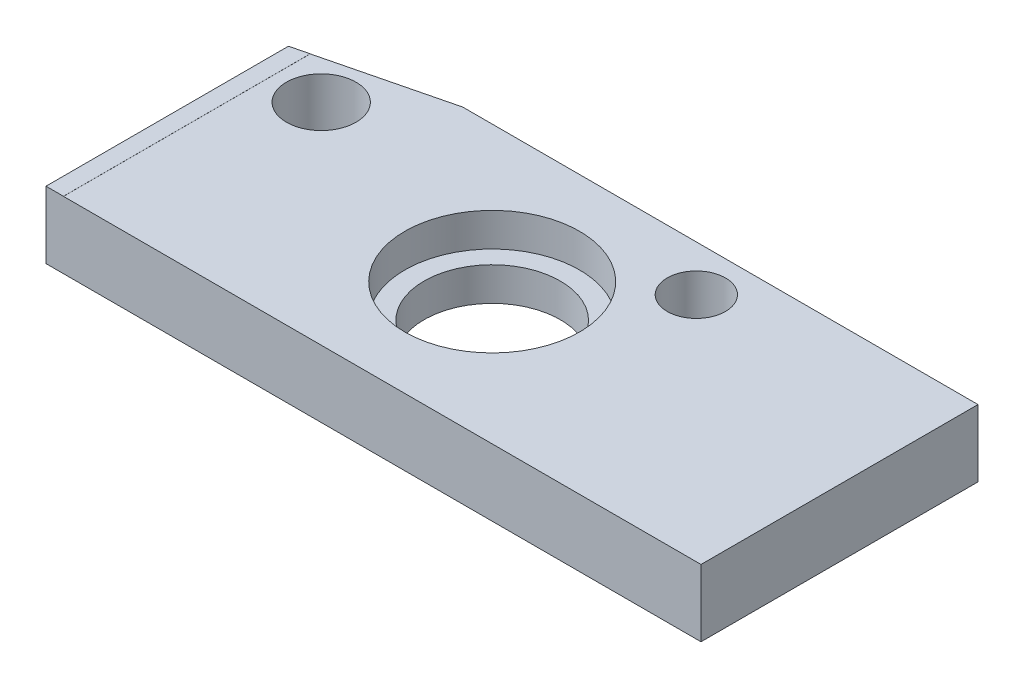
ISO-10303-21;
HEADER;
FILE_DESCRIPTION(('STEP AP214'),'2;1');
FILE_NAME('part.step','',(''),(''),'','','');
FILE_SCHEMA(('AUTOMOTIVE_DESIGN { 1 0 10303 214 1 1 1 1 }'));
ENDSEC;
DATA;
#1=APPLICATION_CONTEXT('core data for automotive mechanical design processes');
#2=APPLICATION_PROTOCOL_DEFINITION('international standard','automotive_design',2000,#1);
#3=PRODUCT_CONTEXT('',#1,'mechanical');
#4=PRODUCT('Part','Part','',(#3));
#5=PRODUCT_RELATED_PRODUCT_CATEGORY('part','',(#4));
#6=PRODUCT_DEFINITION_FORMATION('','',#4);
#7=PRODUCT_DEFINITION_CONTEXT('part definition',#1,'design');
#8=PRODUCT_DEFINITION('design','',#6,#7);
#9=PRODUCT_DEFINITION_SHAPE('','',#8);
#10=(LENGTH_UNIT() NAMED_UNIT(*) SI_UNIT(.MILLI.,.METRE.));
#11=(NAMED_UNIT(*) PLANE_ANGLE_UNIT() SI_UNIT($,.RADIAN.));
#12=(NAMED_UNIT(*) SI_UNIT($,.STERADIAN.) SOLID_ANGLE_UNIT());
#13=UNCERTAINTY_MEASURE_WITH_UNIT(LENGTH_MEASURE(1.E-05),#10,'distance_accuracy_value','');
#14=(GEOMETRIC_REPRESENTATION_CONTEXT(3) GLOBAL_UNCERTAINTY_ASSIGNED_CONTEXT((#13)) GLOBAL_UNIT_ASSIGNED_CONTEXT((#10,
#11,#12)) REPRESENTATION_CONTEXT('',''));
#15=CARTESIAN_POINT('',(0.,0.,0.));
#16=DIRECTION('',(0.,0.,1.));
#17=DIRECTION('',(1.,0.,0.));
#18=AXIS2_PLACEMENT_3D('',#15,#16,#17);
#19=CARTESIAN_POINT('',(0.,24.35352,0.));
#20=DIRECTION('',(0.,1.,0.));
#21=DIRECTION('',(0.,0.,1.));
#22=AXIS2_PLACEMENT_3D('',#19,#20,#21);
#23=PLANE('',#22);
#24=CARTESIAN_POINT('',(104.78262,24.35352,-51.0794));
#25=DIRECTION('',(0.,1.,0.));
#26=DIRECTION('',(0.,0.,1.));
#27=AXIS2_PLACEMENT_3D('',#24,#25,#26);
#28=CIRCLE('',#27,31.75);
#29=CARTESIAN_POINT('',(104.78262,24.35352,-19.3294));
#30=VERTEX_POINT('',#29);
#31=EDGE_CURVE('E132',#30,#30,#28,.T.);
#32=ORIENTED_EDGE('',*,*,#31,.F.);
#33=EDGE_LOOP('',(#32));
#34=FACE_BOUND('',#33,.T.);
#35=CARTESIAN_POINT('',(17.2084999999999,24.35352,-76.49718));
#36=DIRECTION('',(0.,1.,0.));
#37=DIRECTION('',(0.,0.,1.));
#38=AXIS2_PLACEMENT_3D('',#35,#36,#37);
#39=CIRCLE('',#38,12.64539);
#40=CARTESIAN_POINT('',(17.2084999999999,24.35352,-63.85179));
#41=VERTEX_POINT('',#40);
#42=EDGE_CURVE('E143',#41,#41,#39,.T.);
#43=ORIENTED_EDGE('',*,*,#42,.F.);
#44=EDGE_LOOP('',(#43));
#45=FACE_BOUND('',#44,.T.);
#46=CARTESIAN_POINT('',(145.99666,24.35352,-84.074));
#47=DIRECTION('',(0.,1.,0.));
#48=DIRECTION('',(0.,0.,1.));
#49=AXIS2_PLACEMENT_3D('',#46,#47,#48);
#50=CIRCLE('',#49,10.58672);
#51=CARTESIAN_POINT('',(145.99666,24.35352,-73.48728));
#52=VERTEX_POINT('',#51);
#53=EDGE_CURVE('E146',#52,#52,#50,.T.);
#54=ORIENTED_EDGE('',*,*,#53,.F.);
#55=EDGE_LOOP('',(#54));
#56=FACE_BOUND('',#55,.T.);
#57=DIRECTION('',(1.,0.,0.));
#58=VECTOR('',#57,1.);
#59=CARTESIAN_POINT('',(0.,24.35352,-100.69322));
#60=LINE('',#59,#58);
#61=CARTESIAN_POINT('',(44.45,24.35352,-100.69322));
#62=VERTEX_POINT('',#61);
#63=CARTESIAN_POINT('',(231.775,24.35352,-100.69322));
#64=VERTEX_POINT('',#63);
#65=EDGE_CURVE('E51',#62,#64,#60,.T.);
#66=ORIENTED_EDGE('',*,*,#65,.F.);
#67=DIRECTION('',(-0.970797765676104,0.,0.239899350058071));
#68=VECTOR('',#67,1.);
#69=CARTESIAN_POINT('',(-20.8926489266877,24.35352,-84.5460268740785));
#70=LINE('',#69,#68);
#71=CARTESIAN_POINT('',(0.,24.35352,-89.7089280216859));
#72=VERTEX_POINT('',#71);
#73=EDGE_CURVE('E121',#62,#72,#70,.T.);
#74=ORIENTED_EDGE('',*,*,#73,.T.);
#75=DIRECTION('',(0.,0.,1.));
#76=VECTOR('',#75,1.);
#77=CARTESIAN_POINT('',(0.,24.35352,-100.69322));
#78=LINE('',#77,#76);
#79=CARTESIAN_POINT('',(0.,24.35352,0.));
#80=VERTEX_POINT('',#79);
#81=EDGE_CURVE('E118',#72,#80,#78,.T.);
#82=ORIENTED_EDGE('',*,*,#81,.T.);
#83=DIRECTION('',(1.,0.,0.));
#84=VECTOR('',#83,1.);
#85=CARTESIAN_POINT('',(0.,24.35352,0.));
#86=LINE('',#85,#84);
#87=CARTESIAN_POINT('',(231.775,24.35352,0.));
#88=VERTEX_POINT('',#87);
#89=EDGE_CURVE('E172',#80,#88,#86,.T.);
#90=ORIENTED_EDGE('',*,*,#89,.T.);
#91=DIRECTION('',(0.,0.,-1.));
#92=VECTOR('',#91,1.);
#93=CARTESIAN_POINT('',(231.775,24.35352,0.));
#94=LINE('',#93,#92);
#95=EDGE_CURVE('E154',#88,#64,#94,.T.);
#96=ORIENTED_EDGE('',*,*,#95,.T.);
#97=EDGE_LOOP('',(#66,#74,#82,#90,#96));
#98=FACE_BOUND('',#97,.T.);
#99=ADVANCED_FACE('F43',(#34,#45,#56,#98),#23,.T.);
#100=CARTESIAN_POINT('',(0.,0.,0.));
#101=DIRECTION('',(0.,1.,0.));
#102=DIRECTION('',(0.,0.,1.));
#103=AXIS2_PLACEMENT_3D('',#100,#101,#102);
#104=PLANE('',#103);
#105=CARTESIAN_POINT('',(104.78262,0.,-51.0794));
#106=DIRECTION('',(0.,1.,0.));
#107=DIRECTION('',(0.,0.,1.));
#108=AXIS2_PLACEMENT_3D('',#105,#106,#107);
#109=CIRCLE('',#108,24.765);
#110=CARTESIAN_POINT('',(104.78262,0.,-26.3144));
#111=VERTEX_POINT('',#110);
#112=EDGE_CURVE('E304',#111,#111,#109,.T.);
#113=ORIENTED_EDGE('',*,*,#112,.T.);
#114=EDGE_LOOP('',(#113));
#115=FACE_BOUND('',#114,.T.);
#116=CARTESIAN_POINT('',(145.99666,0.,-84.074));
#117=DIRECTION('',(0.,1.,0.));
#118=DIRECTION('',(0.,0.,1.));
#119=AXIS2_PLACEMENT_3D('',#116,#117,#118);
#120=CIRCLE('',#119,10.58672);
#121=CARTESIAN_POINT('',(145.99666,0.,-73.48728));
#122=VERTEX_POINT('',#121);
#123=EDGE_CURVE('E138',#122,#122,#120,.T.);
#124=ORIENTED_EDGE('',*,*,#123,.T.);
#125=EDGE_LOOP('',(#124));
#126=FACE_BOUND('',#125,.T.);
#127=CARTESIAN_POINT('',(17.2084999999999,0.,-76.49718));
#128=DIRECTION('',(0.,1.,0.));
#129=DIRECTION('',(0.,0.,1.));
#130=AXIS2_PLACEMENT_3D('',#127,#128,#129);
#131=CIRCLE('',#130,12.64539);
#132=CARTESIAN_POINT('',(17.2084999999999,0.,-63.85179));
#133=VERTEX_POINT('',#132);
#134=EDGE_CURVE('E139',#133,#133,#131,.T.);
#135=ORIENTED_EDGE('',*,*,#134,.T.);
#136=EDGE_LOOP('',(#135));
#137=FACE_BOUND('',#136,.T.);
#138=DIRECTION('',(-0.970797765676104,0.,0.239899350058071));
#139=VECTOR('',#138,1.);
#140=CARTESIAN_POINT('',(-20.8926489266877,0.,-84.5460268740785));
#141=LINE('',#140,#139);
#142=CARTESIAN_POINT('',(44.45,0.,-100.69322));
#143=VERTEX_POINT('',#142);
#144=CARTESIAN_POINT('',(-6.35000000000006,0.,-88.1397434533553));
#145=VERTEX_POINT('',#144);
#146=EDGE_CURVE('E66',#143,#145,#141,.T.);
#147=ORIENTED_EDGE('',*,*,#146,.F.);
#148=DIRECTION('',(1.,0.,0.));
#149=VECTOR('',#148,1.);
#150=CARTESIAN_POINT('',(0.,0.,-100.69322));
#151=LINE('',#150,#149);
#152=CARTESIAN_POINT('',(231.775,0.,-100.69322));
#153=VERTEX_POINT('',#152);
#154=EDGE_CURVE('E173',#143,#153,#151,.T.);
#155=ORIENTED_EDGE('',*,*,#154,.T.);
#156=DIRECTION('',(0.,0.,-1.));
#157=VECTOR('',#156,1.);
#158=CARTESIAN_POINT('',(231.775,0.,0.));
#159=LINE('',#158,#157);
#160=CARTESIAN_POINT('',(231.775,0.,0.));
#161=VERTEX_POINT('',#160);
#162=EDGE_CURVE('E157',#161,#153,#159,.T.);
#163=ORIENTED_EDGE('',*,*,#162,.F.);
#164=DIRECTION('',(1.,0.,0.));
#165=VECTOR('',#164,1.);
#166=CARTESIAN_POINT('',(0.,0.,0.));
#167=LINE('',#166,#165);
#168=CARTESIAN_POINT('',(-6.35000000000006,0.,0.));
#169=VERTEX_POINT('',#168);
#170=EDGE_CURVE('E111',#169,#161,#167,.T.);
#171=ORIENTED_EDGE('',*,*,#170,.F.);
#172=DIRECTION('',(0.,0.,-1.));
#173=VECTOR('',#172,1.);
#174=CARTESIAN_POINT('',(-6.35000000000006,0.,0.));
#175=LINE('',#174,#173);
#176=EDGE_CURVE('E168',#169,#145,#175,.T.);
#177=ORIENTED_EDGE('',*,*,#176,.T.);
#178=EDGE_LOOP('',(#147,#155,#163,#171,#177));
#179=FACE_BOUND('',#178,.T.);
#180=ADVANCED_FACE('F177',(#115,#126,#137,#179),#104,.F.);
#181=CARTESIAN_POINT('',(0.,0.,0.));
#182=DIRECTION('',(-1.,0.,0.));
#183=DIRECTION('',(0.,0.,1.));
#184=AXIS2_PLACEMENT_3D('',#181,#182,#183);
#185=PLANE('',#184);
#186=DIRECTION('',(0.,-1.,0.));
#187=VECTOR('',#186,1.);
#188=CARTESIAN_POINT('',(0.,0.,-89.7089280216859));
#189=LINE('',#188,#187);
#190=CARTESIAN_POINT('',(0.,24.3853764658297,-89.7089280216859));
#191=VERTEX_POINT('',#190);
#192=EDGE_CURVE('E116',#191,#72,#189,.T.);
#193=ORIENTED_EDGE('',*,*,#192,.F.);
#194=DIRECTION('',(0.,0.,-1.));
#195=VECTOR('',#194,1.);
#196=CARTESIAN_POINT('',(0.,24.3853764658297,0.));
#197=LINE('',#196,#195);
#198=CARTESIAN_POINT('',(0.,24.3853764658297,0.));
#199=VERTEX_POINT('',#198);
#200=EDGE_CURVE('E103',#199,#191,#197,.T.);
#201=ORIENTED_EDGE('',*,*,#200,.F.);
#202=DIRECTION('',(0.,1.,0.));
#203=VECTOR('',#202,1.);
#204=CARTESIAN_POINT('',(0.,0.,0.));
#205=LINE('',#204,#203);
#206=EDGE_CURVE('E160',#80,#199,#205,.T.);
#207=ORIENTED_EDGE('',*,*,#206,.F.);
#208=ORIENTED_EDGE('',*,*,#81,.F.);
#209=EDGE_LOOP('',(#193,#201,#207,#208));
#210=FACE_BOUND('',#209,.T.);
#211=ADVANCED_FACE('F117',(#210),#185,.F.);
#212=CARTESIAN_POINT('',(0.,24.3853764658297,0.));
#213=DIRECTION('',(0.,-1.,0.));
#214=DIRECTION('',(1.,0.,0.));
#215=AXIS2_PLACEMENT_3D('',#212,#213,#214);
#216=PLANE('',#215);
#217=DIRECTION('',(0.970797765676104,0.,-0.239899350058071));
#218=VECTOR('',#217,1.);
#219=CARTESIAN_POINT('',(-20.8926489266878,24.3853764658297,-84.5460268740785));
#220=LINE('',#219,#218);
#221=CARTESIAN_POINT('',(-6.35000000000006,24.3853764658297,-88.1397434533553));
#222=VERTEX_POINT('',#221);
#223=EDGE_CURVE('E11',#222,#191,#220,.T.);
#224=ORIENTED_EDGE('',*,*,#223,.F.);
#225=DIRECTION('',(0.,0.,-1.));
#226=VECTOR('',#225,1.);
#227=CARTESIAN_POINT('',(-6.35000000000006,24.3853764658297,0.));
#228=LINE('',#227,#226);
#229=CARTESIAN_POINT('',(-6.35000000000006,24.3853764658297,0.));
#230=VERTEX_POINT('',#229);
#231=EDGE_CURVE('E112',#230,#222,#228,.T.);
#232=ORIENTED_EDGE('',*,*,#231,.F.);
#233=DIRECTION('',(-1.,0.,0.));
#234=VECTOR('',#233,1.);
#235=CARTESIAN_POINT('',(0.,24.3853764658297,0.));
#236=LINE('',#235,#234);
#237=EDGE_CURVE('E108',#199,#230,#236,.T.);
#238=ORIENTED_EDGE('',*,*,#237,.F.);
#239=ORIENTED_EDGE('',*,*,#200,.T.);
#240=EDGE_LOOP('',(#224,#232,#238,#239));
#241=FACE_BOUND('',#240,.T.);
#242=ADVANCED_FACE('F105',(#241),#216,.F.);
#243=CARTESIAN_POINT('',(0.,24.35352,0.));
#244=DIRECTION('',(0.,0.,-1.));
#245=DIRECTION('',(-1.,0.,0.));
#246=AXIS2_PLACEMENT_3D('',#243,#244,#245);
#247=PLANE('',#246);
#248=ORIENTED_EDGE('',*,*,#170,.T.);
#249=DIRECTION('',(0.,-1.,0.));
#250=VECTOR('',#249,1.);
#251=CARTESIAN_POINT('',(231.775,0.,0.));
#252=LINE('',#251,#250);
#253=EDGE_CURVE('E151',#88,#161,#252,.T.);
#254=ORIENTED_EDGE('',*,*,#253,.F.);
#255=ORIENTED_EDGE('',*,*,#89,.F.);
#256=ORIENTED_EDGE('',*,*,#206,.T.);
#257=ORIENTED_EDGE('',*,*,#237,.T.);
#258=DIRECTION('',(0.,-1.,0.));
#259=VECTOR('',#258,1.);
#260=CARTESIAN_POINT('',(-6.35000000000006,0.,0.));
#261=LINE('',#260,#259);
#262=EDGE_CURVE('E165',#230,#169,#261,.T.);
#263=ORIENTED_EDGE('',*,*,#262,.T.);
#264=EDGE_LOOP('',(#248,#254,#255,#256,#257,#263));
#265=FACE_BOUND('',#264,.T.);
#266=ADVANCED_FACE('F45',(#265),#247,.F.);
#267=CARTESIAN_POINT('',(0.,24.35352,-100.69322));
#268=DIRECTION('',(0.,0.,-1.));
#269=DIRECTION('',(-1.,0.,0.));
#270=AXIS2_PLACEMENT_3D('',#267,#268,#269);
#271=PLANE('',#270);
#272=DIRECTION('',(0.,-1.,0.));
#273=VECTOR('',#272,1.);
#274=CARTESIAN_POINT('',(44.4499999999997,379.475723811632,-100.69322));
#275=LINE('',#274,#273);
#276=EDGE_CURVE('E58',#62,#143,#275,.T.);
#277=ORIENTED_EDGE('',*,*,#276,.F.);
#278=ORIENTED_EDGE('',*,*,#65,.T.);
#279=DIRECTION('',(0.,-1.,0.));
#280=VECTOR('',#279,1.);
#281=CARTESIAN_POINT('',(231.775,0.,-100.69322));
#282=LINE('',#281,#280);
#283=EDGE_CURVE('E142',#64,#153,#282,.T.);
#284=ORIENTED_EDGE('',*,*,#283,.T.);
#285=ORIENTED_EDGE('',*,*,#154,.F.);
#286=EDGE_LOOP('',(#277,#278,#284,#285));
#287=FACE_BOUND('',#286,.T.);
#288=ADVANCED_FACE('F183',(#287),#271,.T.);
#289=CARTESIAN_POINT('',(-6.35000000000006,0.,0.));
#290=DIRECTION('',(1.,0.,0.));
#291=DIRECTION('',(0.,0.,-1.));
#292=AXIS2_PLACEMENT_3D('',#289,#290,#291);
#293=PLANE('',#292);
#294=ORIENTED_EDGE('',*,*,#231,.T.);
#295=DIRECTION('',(0.,-1.,0.));
#296=VECTOR('',#295,1.);
#297=CARTESIAN_POINT('',(-6.35000000000025,379.475723811632,-88.1397434533553));
#298=LINE('',#297,#296);
#299=EDGE_CURVE('E125',#222,#145,#298,.T.);
#300=ORIENTED_EDGE('',*,*,#299,.T.);
#301=ORIENTED_EDGE('',*,*,#176,.F.);
#302=ORIENTED_EDGE('',*,*,#262,.F.);
#303=EDGE_LOOP('',(#294,#300,#301,#302));
#304=FACE_BOUND('',#303,.T.);
#305=ADVANCED_FACE('F188',(#304),#293,.F.);
#306=CARTESIAN_POINT('',(231.775,0.,0.));
#307=DIRECTION('',(1.,0.,0.));
#308=DIRECTION('',(0.,0.,-1.));
#309=AXIS2_PLACEMENT_3D('',#306,#307,#308);
#310=PLANE('',#309);
#311=ORIENTED_EDGE('',*,*,#283,.F.);
#312=ORIENTED_EDGE('',*,*,#95,.F.);
#313=ORIENTED_EDGE('',*,*,#253,.T.);
#314=ORIENTED_EDGE('',*,*,#162,.T.);
#315=EDGE_LOOP('',(#311,#312,#313,#314));
#316=FACE_BOUND('',#315,.T.);
#317=ADVANCED_FACE('F180',(#316),#310,.T.);
#318=CARTESIAN_POINT('',(145.99666,0.,-84.074));
#319=DIRECTION('',(0.,1.,0.));
#320=DIRECTION('',(0.,0.,1.));
#321=AXIS2_PLACEMENT_3D('',#318,#319,#320);
#322=CYLINDRICAL_SURFACE('',#321,10.58672);
#323=ORIENTED_EDGE('',*,*,#123,.F.);
#324=EDGE_LOOP('',(#323));
#325=FACE_BOUND('',#324,.T.);
#326=ORIENTED_EDGE('',*,*,#53,.T.);
#327=EDGE_LOOP('',(#326));
#328=FACE_BOUND('',#327,.T.);
#329=ADVANCED_FACE('F196',(#325,#328),#322,.F.);
#330=CARTESIAN_POINT('',(17.2084999999999,0.,-76.49718));
#331=DIRECTION('',(0.,1.,0.));
#332=DIRECTION('',(0.,0.,1.));
#333=AXIS2_PLACEMENT_3D('',#330,#331,#332);
#334=CYLINDRICAL_SURFACE('',#333,12.64539);
#335=ORIENTED_EDGE('',*,*,#134,.F.);
#336=EDGE_LOOP('',(#335));
#337=FACE_BOUND('',#336,.T.);
#338=ORIENTED_EDGE('',*,*,#42,.T.);
#339=EDGE_LOOP('',(#338));
#340=FACE_BOUND('',#339,.T.);
#341=ADVANCED_FACE('F231',(#337,#340),#334,.F.);
#342=CARTESIAN_POINT('',(-6.35000000000025,379.475723811632,-88.1397434533553));
#343=DIRECTION('',(-0.239899350058071,0.,-0.970797765676104));
#344=DIRECTION('',(-0.970797765676104,0.,0.239899350058071));
#345=AXIS2_PLACEMENT_3D('',#342,#343,#344);
#346=PLANE('',#345);
#347=ORIENTED_EDGE('',*,*,#276,.T.);
#348=ORIENTED_EDGE('',*,*,#146,.T.);
#349=ORIENTED_EDGE('',*,*,#299,.F.);
#350=ORIENTED_EDGE('',*,*,#223,.T.);
#351=ORIENTED_EDGE('',*,*,#192,.T.);
#352=ORIENTED_EDGE('',*,*,#73,.F.);
#353=EDGE_LOOP('',(#347,#348,#349,#350,#351,#352));
#354=FACE_BOUND('',#353,.T.);
#355=ADVANCED_FACE('F124',(#354),#346,.T.);
#356=CARTESIAN_POINT('',(104.78262,12.17676,-51.0794));
#357=DIRECTION('',(0.,1.,0.));
#358=DIRECTION('',(0.,0.,1.));
#359=AXIS2_PLACEMENT_3D('',#356,#357,#358);
#360=CYLINDRICAL_SURFACE('',#359,31.75);
#361=CARTESIAN_POINT('',(104.78262,12.17676,-51.0794));
#362=DIRECTION('',(0.,1.,0.));
#363=DIRECTION('',(0.,0.,1.));
#364=AXIS2_PLACEMENT_3D('',#361,#362,#363);
#365=CIRCLE('',#364,31.75);
#366=CARTESIAN_POINT('',(104.78262,12.17676,-19.3294));
#367=VERTEX_POINT('',#366);
#368=EDGE_CURVE('E128',#367,#367,#365,.T.);
#369=CARTESIAN_POINT('',(104.78262,12.17676,-19.3294));
#370=CARTESIAN_POINT('',(104.78262,12.30360125,-19.3294));
#371=CARTESIAN_POINT('',(104.78262,12.4304425,-19.3294));
#372=CARTESIAN_POINT('',(104.78262,12.684125,-19.3294));
#373=CARTESIAN_POINT('',(104.78262,12.81096625,-19.3294));
#374=CARTESIAN_POINT('',(104.78262,13.06464875,-19.3294));
#375=CARTESIAN_POINT('',(104.78262,13.19149,-19.3294));
#376=CARTESIAN_POINT('',(104.78262,13.4451725,-19.3294));
#377=CARTESIAN_POINT('',(104.78262,13.57201375,-19.3294));
#378=CARTESIAN_POINT('',(104.78262,13.82569625,-19.3294));
#379=CARTESIAN_POINT('',(104.78262,13.9525375,-19.3294));
#380=CARTESIAN_POINT('',(104.78262,14.20622,-19.3294));
#381=CARTESIAN_POINT('',(104.78262,14.33306125,-19.3294));
#382=CARTESIAN_POINT('',(104.78262,14.58674375,-19.3294));
#383=CARTESIAN_POINT('',(104.78262,14.713585,-19.3294));
#384=CARTESIAN_POINT('',(104.78262,14.9672675,-19.3294));
#385=CARTESIAN_POINT('',(104.78262,15.09410875,-19.3294));
#386=CARTESIAN_POINT('',(104.78262,15.34779125,-19.3294));
#387=CARTESIAN_POINT('',(104.78262,15.4746325,-19.3294));
#388=CARTESIAN_POINT('',(104.78262,15.728315,-19.3294));
#389=CARTESIAN_POINT('',(104.78262,15.85515625,-19.3294));
#390=CARTESIAN_POINT('',(104.78262,16.10883875,-19.3294));
#391=CARTESIAN_POINT('',(104.78262,16.23568,-19.3294));
#392=CARTESIAN_POINT('',(104.78262,16.4893625,-19.3294));
#393=CARTESIAN_POINT('',(104.78262,16.61620375,-19.3294));
#394=CARTESIAN_POINT('',(104.78262,16.86988625,-19.3294));
#395=CARTESIAN_POINT('',(104.78262,16.9967275,-19.3294));
#396=CARTESIAN_POINT('',(104.78262,17.25041,-19.3294));
#397=CARTESIAN_POINT('',(104.78262,17.37725125,-19.3294));
#398=CARTESIAN_POINT('',(104.78262,17.63093375,-19.3294));
#399=CARTESIAN_POINT('',(104.78262,17.757775,-19.3294));
#400=CARTESIAN_POINT('',(104.78262,18.0114575,-19.3294));
#401=CARTESIAN_POINT('',(104.78262,18.13829875,-19.3294));
#402=CARTESIAN_POINT('',(104.78262,18.39198125,-19.3294));
#403=CARTESIAN_POINT('',(104.78262,18.5188225,-19.3294));
#404=CARTESIAN_POINT('',(104.78262,18.772505,-19.3294));
#405=CARTESIAN_POINT('',(104.78262,18.89934625,-19.3294));
#406=CARTESIAN_POINT('',(104.78262,19.15302875,-19.3294));
#407=CARTESIAN_POINT('',(104.78262,19.27987,-19.3294));
#408=CARTESIAN_POINT('',(104.78262,19.5335525,-19.3294));
#409=CARTESIAN_POINT('',(104.78262,19.66039375,-19.3294));
#410=CARTESIAN_POINT('',(104.78262,19.91407625,-19.3294));
#411=CARTESIAN_POINT('',(104.78262,20.0409175,-19.3294));
#412=CARTESIAN_POINT('',(104.78262,20.2946,-19.3294));
#413=CARTESIAN_POINT('',(104.78262,20.42144125,-19.3294));
#414=CARTESIAN_POINT('',(104.78262,20.67512375,-19.3294));
#415=CARTESIAN_POINT('',(104.78262,20.801965,-19.3294));
#416=CARTESIAN_POINT('',(104.78262,21.0556475,-19.3294));
#417=CARTESIAN_POINT('',(104.78262,21.18248875,-19.3294));
#418=CARTESIAN_POINT('',(104.78262,21.43617125,-19.3294));
#419=CARTESIAN_POINT('',(104.78262,21.5630125,-19.3294));
#420=CARTESIAN_POINT('',(104.78262,21.816695,-19.3294));
#421=CARTESIAN_POINT('',(104.78262,21.94353625,-19.3294));
#422=CARTESIAN_POINT('',(104.78262,22.19721875,-19.3294));
#423=CARTESIAN_POINT('',(104.78262,22.32406,-19.3294));
#424=CARTESIAN_POINT('',(104.78262,22.5777425,-19.3294));
#425=CARTESIAN_POINT('',(104.78262,22.70458375,-19.3294));
#426=CARTESIAN_POINT('',(104.78262,22.95826625,-19.3294));
#427=CARTESIAN_POINT('',(104.78262,23.0851075,-19.3294));
#428=CARTESIAN_POINT('',(104.78262,23.33879,-19.3294));
#429=CARTESIAN_POINT('',(104.78262,23.46563125,-19.3294));
#430=CARTESIAN_POINT('',(104.78262,23.71931375,-19.3294));
#431=CARTESIAN_POINT('',(104.78262,23.846155,-19.3294));
#432=CARTESIAN_POINT('',(104.78262,24.0998375,-19.3294));
#433=CARTESIAN_POINT('',(104.78262,24.22667875,-19.3294));
#434=CARTESIAN_POINT('',(104.78262,24.35352,-19.3294));
#435=B_SPLINE_CURVE_WITH_KNOTS('',3,(#369,#370,#371,#372,#373,#374,#375,#376,#377,#378,#379,
#380,#381,#382,#383,#384,#385,#386,#387,#388,#389,#390,#391,#392,#393,#394,#395,#396,#397,#398,
#399,#400,#401,#402,#403,#404,#405,#406,#407,#408,#409,#410,#411,#412,#413,#414,#415,#416,#417,
#418,#419,#420,#421,#422,#423,#424,#425,#426,#427,#428,#429,#430,#431,#432,#433,#434),
.UNSPECIFIED.,.F.,.F.,(4,2,2,2,2,2,2,2,2,2,2,2,2,2,2,2,2,2,2,2,2,2,2,2,2,2,2,2,2,2,2,2,4),(0.,
0.380523749999999,0.761047499999999,1.14157125,1.522095,1.90261875,2.2831425,2.66366625,3.04419,
3.42471375,3.8052375,4.18576125,4.566285,4.94680875,5.3273325,5.70785625,6.08838,6.46890375,
6.8494275,7.22995125,7.610475,7.99099875,8.3715225,8.75204625,9.13257,9.51309375,9.8936175,
10.27414125,10.654665,11.03518875,11.4157125,11.79623625,12.17676),.UNSPECIFIED.);
#436=EDGE_CURVE('BSEAM271',#367,#30,#435,.T.);
#437=ORIENTED_EDGE('',*,*,#368,.F.);
#438=ORIENTED_EDGE('',*,*,#31,.T.);
#439=ORIENTED_EDGE('',*,*,#436,.T.);
#440=ORIENTED_EDGE('',*,*,#436,.F.);
#441=EDGE_LOOP('',(#437,#439,#438,#440));
#442=FACE_BOUND('',#441,.T.);
#443=ADVANCED_FACE('F271',(#442),#360,.F.);
#444=CARTESIAN_POINT('',(104.78262,12.17676,-51.0794));
#445=DIRECTION('',(0.,1.,0.));
#446=DIRECTION('',(0.,0.,1.));
#447=AXIS2_PLACEMENT_3D('',#444,#445,#446);
#448=PLANE('',#447);
#449=CARTESIAN_POINT('',(104.78262,12.17676,-51.0794));
#450=DIRECTION('',(0.,1.,0.));
#451=DIRECTION('',(0.,0.,1.));
#452=AXIS2_PLACEMENT_3D('',#449,#450,#451);
#453=CIRCLE('',#452,24.765);
#454=CARTESIAN_POINT('',(104.78262,12.17676,-26.3144));
#455=VERTEX_POINT('',#454);
#456=EDGE_CURVE('E301',#455,#455,#453,.T.);
#457=ORIENTED_EDGE('',*,*,#456,.F.);
#458=EDGE_LOOP('',(#457));
#459=FACE_BOUND('',#458,.T.);
#460=ORIENTED_EDGE('',*,*,#368,.T.);
#461=EDGE_LOOP('',(#460));
#462=FACE_BOUND('',#461,.T.);
#463=ADVANCED_FACE('F278',(#459,#462),#448,.T.);
#464=CARTESIAN_POINT('',(104.78262,0.,-51.0794));
#465=DIRECTION('',(0.,1.,0.));
#466=DIRECTION('',(0.,0.,1.));
#467=AXIS2_PLACEMENT_3D('',#464,#465,#466);
#468=CYLINDRICAL_SURFACE('',#467,24.765);
#469=ORIENTED_EDGE('',*,*,#456,.T.);
#470=EDGE_LOOP('',(#469));
#471=FACE_BOUND('',#470,.T.);
#472=ORIENTED_EDGE('',*,*,#112,.F.);
#473=EDGE_LOOP('',(#472));
#474=FACE_BOUND('',#473,.T.);
#475=ADVANCED_FACE('F286',(#471,#474),#468,.F.);
#476=CLOSED_SHELL('',(#99,#180,#211,#242,#266,#288,#305,#317,#329,#341,#355,#443,#463,#475));
#477=MANIFOLD_SOLID_BREP('B2',#476);
#478=ADVANCED_BREP_SHAPE_REPRESENTATION('',(#18,#477),#14);
#479=SHAPE_DEFINITION_REPRESENTATION(#9,#478);
ENDSEC;
END-ISO-10303-21;
